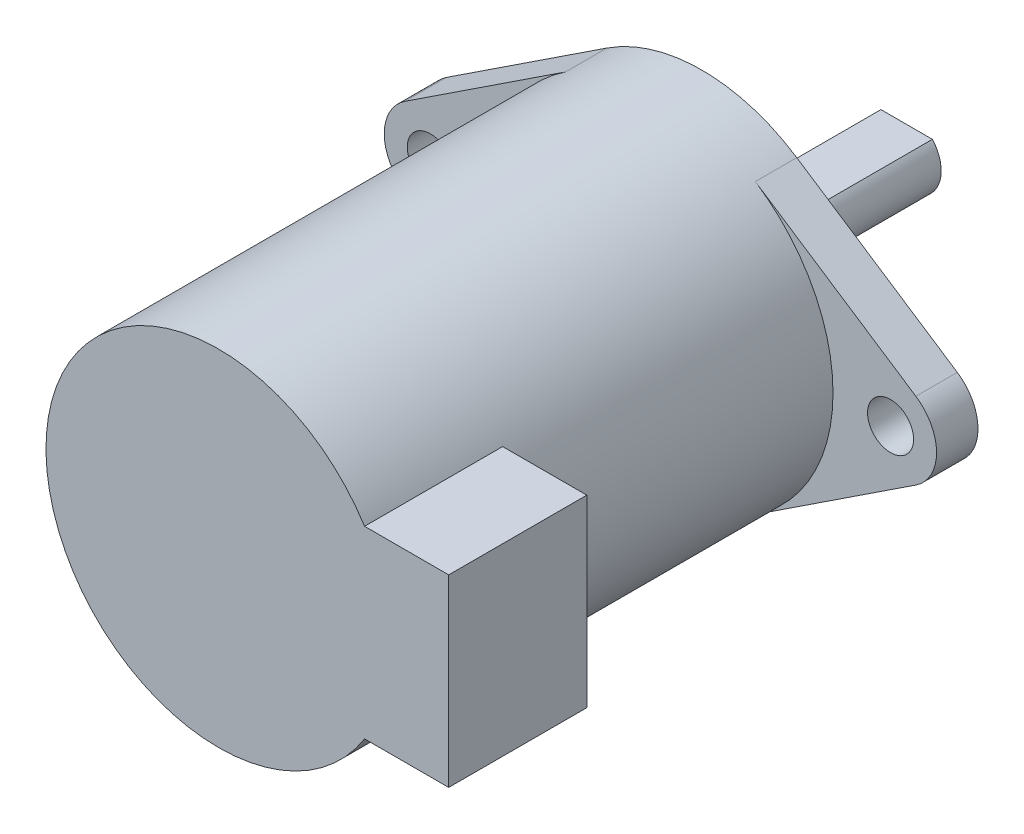
ISO-10303-21;
HEADER;
FILE_DESCRIPTION(('STEP AP214'),'2;1');
FILE_NAME('part.step','',(''),(''),'','','');
FILE_SCHEMA(('AUTOMOTIVE_DESIGN { 1 0 10303 214 1 1 1 1 }'));
ENDSEC;
DATA;
#1=APPLICATION_CONTEXT('core data for automotive mechanical design processes');
#2=APPLICATION_PROTOCOL_DEFINITION('international standard','automotive_design',2000,#1);
#3=PRODUCT_CONTEXT('',#1,'mechanical');
#4=PRODUCT('Part','Part','',(#3));
#5=PRODUCT_RELATED_PRODUCT_CATEGORY('part','',(#4));
#6=PRODUCT_DEFINITION_FORMATION('','',#4);
#7=PRODUCT_DEFINITION_CONTEXT('part definition',#1,'design');
#8=PRODUCT_DEFINITION('design','',#6,#7);
#9=PRODUCT_DEFINITION_SHAPE('','',#8);
#10=(LENGTH_UNIT() NAMED_UNIT(*) SI_UNIT(.MILLI.,.METRE.));
#11=(NAMED_UNIT(*) PLANE_ANGLE_UNIT() SI_UNIT($,.RADIAN.));
#12=(NAMED_UNIT(*) SI_UNIT($,.STERADIAN.) SOLID_ANGLE_UNIT());
#13=UNCERTAINTY_MEASURE_WITH_UNIT(LENGTH_MEASURE(1.E-05),#10,'distance_accuracy_value','');
#14=(GEOMETRIC_REPRESENTATION_CONTEXT(3) GLOBAL_UNCERTAINTY_ASSIGNED_CONTEXT((#13)) GLOBAL_UNIT_ASSIGNED_CONTEXT((#10,
#11,#12)) REPRESENTATION_CONTEXT('',''));
#15=CARTESIAN_POINT('',(0.,0.,0.));
#16=DIRECTION('',(0.,0.,1.));
#17=DIRECTION('',(1.,0.,0.));
#18=AXIS2_PLACEMENT_3D('',#15,#16,#17);
#19=CARTESIAN_POINT('',(0.,0.,21.));
#20=DIRECTION('',(0.,0.,-1.));
#21=DIRECTION('',(-1.,0.,0.));
#22=AXIS2_PLACEMENT_3D('',#19,#20,#21);
#23=CYLINDRICAL_SURFACE('',#22,7.5);
#24=DIRECTION('',(0.,0.,-1.));
#25=VECTOR('',#24,1.);
#26=CARTESIAN_POINT('',(-4.125,6.26373490818377,1.8));
#27=LINE('',#26,#25);
#28=CARTESIAN_POINT('',(-4.125,6.26373490818378,1.8));
#29=VERTEX_POINT('',#28);
#30=CARTESIAN_POINT('',(-4.125,6.26373490818377,0.));
#31=VERTEX_POINT('',#30);
#32=EDGE_CURVE('E259',#29,#31,#27,.T.);
#33=ORIENTED_EDGE('',*,*,#32,.F.);
#34=CARTESIAN_POINT('',(0.,0.,1.8));
#35=DIRECTION('',(0.,0.,-1.));
#36=DIRECTION('',(-1.,0.,0.));
#37=AXIS2_PLACEMENT_3D('',#34,#35,#36);
#38=CIRCLE('',#37,7.5);
#39=CARTESIAN_POINT('',(-4.125,-6.26373490818377,1.8));
#40=VERTEX_POINT('',#39);
#41=EDGE_CURVE('E290',#40,#29,#38,.T.);
#42=ORIENTED_EDGE('',*,*,#41,.F.);
#43=DIRECTION('',(0.,0.,-1.));
#44=VECTOR('',#43,1.);
#45=CARTESIAN_POINT('',(-4.125,-6.26373490818378,1.8));
#46=LINE('',#45,#44);
#47=CARTESIAN_POINT('',(-4.125,-6.26373490818378,0.));
#48=VERTEX_POINT('',#47);
#49=EDGE_CURVE('E241',#40,#48,#46,.T.);
#50=ORIENTED_EDGE('',*,*,#49,.T.);
#51=CARTESIAN_POINT('',(0.,0.,0.));
#52=DIRECTION('',(0.,0.,1.));
#53=DIRECTION('',(1.,0.,0.));
#54=AXIS2_PLACEMENT_3D('',#51,#52,#53);
#55=CIRCLE('',#54,7.5);
#56=CARTESIAN_POINT('',(4.125,-6.26373490818378,0.));
#57=VERTEX_POINT('',#56);
#58=EDGE_CURVE('E295',#48,#57,#55,.T.);
#59=ORIENTED_EDGE('',*,*,#58,.T.);
#60=DIRECTION('',(0.,0.,-1.));
#61=VECTOR('',#60,1.);
#62=CARTESIAN_POINT('',(4.125,-6.26373490818377,1.8));
#63=LINE('',#62,#61);
#64=CARTESIAN_POINT('',(4.125,-6.26373490818377,1.8));
#65=VERTEX_POINT('',#64);
#66=EDGE_CURVE('E245',#65,#57,#63,.T.);
#67=ORIENTED_EDGE('',*,*,#66,.F.);
#68=CARTESIAN_POINT('',(4.125,6.26373490818378,1.8));
#69=VERTEX_POINT('',#68);
#70=EDGE_CURVE('E47',#69,#65,#38,.T.);
#71=ORIENTED_EDGE('',*,*,#70,.F.);
#72=DIRECTION('',(0.,0.,-1.));
#73=VECTOR('',#72,1.);
#74=CARTESIAN_POINT('',(4.125,6.26373490818377,1.8));
#75=LINE('',#74,#73);
#76=CARTESIAN_POINT('',(4.125,6.26373490818377,0.));
#77=VERTEX_POINT('',#76);
#78=EDGE_CURVE('E255',#69,#77,#75,.T.);
#79=ORIENTED_EDGE('',*,*,#78,.T.);
#80=EDGE_CURVE('E302',#77,#31,#55,.T.);
#81=ORIENTED_EDGE('',*,*,#80,.T.);
#82=EDGE_LOOP('',(#33,#42,#50,#59,#67,#71,#79,#81));
#83=FACE_BOUND('',#82,.T.);
#84=DIRECTION('',(0.,0.,-1.));
#85=VECTOR('',#84,1.);
#86=CARTESIAN_POINT('',(6.34428877022476,4.,21.));
#87=LINE('',#86,#85);
#88=CARTESIAN_POINT('',(6.34428877022476,4.,15.));
#89=VERTEX_POINT('',#88);
#90=CARTESIAN_POINT('',(6.34428877022476,4.,21.));
#91=VERTEX_POINT('',#90);
#92=EDGE_CURVE('E54',#89,#91,#87,.F.);
#93=ORIENTED_EDGE('',*,*,#92,.F.);
#94=CARTESIAN_POINT('',(0.,0.,15.));
#95=DIRECTION('',(0.,0.,1.));
#96=DIRECTION('',(0.,-1.,0.));
#97=AXIS2_PLACEMENT_3D('',#94,#95,#96);
#98=CIRCLE('',#97,7.5);
#99=CARTESIAN_POINT('',(6.34428877022476,-4.,15.));
#100=VERTEX_POINT('',#99);
#101=EDGE_CURVE('E11',#100,#89,#98,.T.);
#102=ORIENTED_EDGE('',*,*,#101,.F.);
#103=DIRECTION('',(0.,0.,-1.));
#104=VECTOR('',#103,1.);
#105=CARTESIAN_POINT('',(6.34428877022476,-4.,21.));
#106=LINE('',#105,#104);
#107=CARTESIAN_POINT('',(6.34428877022476,-4.,21.));
#108=VERTEX_POINT('',#107);
#109=EDGE_CURVE('E58',#108,#100,#106,.T.);
#110=ORIENTED_EDGE('',*,*,#109,.F.);
#111=CARTESIAN_POINT('',(0.,0.,21.));
#112=DIRECTION('',(0.,0.,1.));
#113=DIRECTION('',(1.,0.,0.));
#114=AXIS2_PLACEMENT_3D('',#111,#112,#113);
#115=CIRCLE('',#114,7.5);
#116=EDGE_CURVE('E299',#91,#108,#115,.T.);
#117=ORIENTED_EDGE('',*,*,#116,.F.);
#118=EDGE_LOOP('',(#93,#102,#110,#117));
#119=FACE_BOUND('',#118,.T.);
#120=ADVANCED_FACE('F39',(#83,#119),#23,.T.);
#121=CARTESIAN_POINT('',(0.,0.,21.));
#122=DIRECTION('',(0.,0.,1.));
#123=DIRECTION('',(1.,0.,0.));
#124=AXIS2_PLACEMENT_3D('',#121,#122,#123);
#125=PLANE('',#124);
#126=ORIENTED_EDGE('',*,*,#116,.T.);
#127=DIRECTION('',(-1.,0.,0.));
#128=VECTOR('',#127,1.);
#129=CARTESIAN_POINT('',(10.,-4.,21.));
#130=LINE('',#129,#128);
#131=CARTESIAN_POINT('',(10.,-4.,21.));
#132=VERTEX_POINT('',#131);
#133=EDGE_CURVE('E166',#132,#108,#130,.T.);
#134=ORIENTED_EDGE('',*,*,#133,.F.);
#135=DIRECTION('',(0.,-1.,0.));
#136=VECTOR('',#135,1.);
#137=CARTESIAN_POINT('',(10.,4.,21.));
#138=LINE('',#137,#136);
#139=CARTESIAN_POINT('',(10.,4.,21.));
#140=VERTEX_POINT('',#139);
#141=EDGE_CURVE('E148',#140,#132,#138,.T.);
#142=ORIENTED_EDGE('',*,*,#141,.F.);
#143=DIRECTION('',(-1.,0.,0.));
#144=VECTOR('',#143,1.);
#145=CARTESIAN_POINT('',(10.,4.,21.));
#146=LINE('',#145,#144);
#147=EDGE_CURVE('E144',#140,#91,#146,.T.);
#148=ORIENTED_EDGE('',*,*,#147,.T.);
#149=EDGE_LOOP('',(#126,#134,#142,#148));
#150=FACE_BOUND('',#149,.T.);
#151=ADVANCED_FACE('F354',(#150),#125,.T.);
#152=CARTESIAN_POINT('',(0.,0.,0.));
#153=DIRECTION('',(0.,0.,1.));
#154=DIRECTION('',(1.,0.,0.));
#155=AXIS2_PLACEMENT_3D('',#152,#153,#154);
#156=PLANE('',#155);
#157=CARTESIAN_POINT('',(0.,0.,0.));
#158=DIRECTION('',(0.,0.,-1.));
#159=DIRECTION('',(-1.,0.,0.));
#160=AXIS2_PLACEMENT_3D('',#157,#158,#159);
#161=CIRCLE('',#160,3.);
#162=CARTESIAN_POINT('',(-3.,0.,0.));
#163=VERTEX_POINT('',#162);
#164=EDGE_CURVE('E291',#163,#163,#161,.T.);
#165=ORIENTED_EDGE('',*,*,#164,.F.);
#166=EDGE_LOOP('',(#165));
#167=FACE_BOUND('',#166,.T.);
#168=ORIENTED_EDGE('',*,*,#80,.F.);
#169=DIRECTION('',(0.835164654424503,-0.55,0.));
#170=VECTOR('',#169,1.);
#171=CARTESIAN_POINT('',(11.1,1.67032930884901,0.));
#172=LINE('',#171,#170);
#173=CARTESIAN_POINT('',(11.1,1.67032930884901,0.));
#174=VERTEX_POINT('',#173);
#175=EDGE_CURVE('E222',#77,#174,#172,.T.);
#176=ORIENTED_EDGE('',*,*,#175,.T.);
#177=CARTESIAN_POINT('',(10.,0.,0.));
#178=DIRECTION('',(0.,0.,-1.));
#179=DIRECTION('',(1.,0.,0.));
#180=AXIS2_PLACEMENT_3D('',#177,#178,#179);
#181=CIRCLE('',#180,2.);
#182=CARTESIAN_POINT('',(11.1,-1.67032930884901,0.));
#183=VERTEX_POINT('',#182);
#184=EDGE_CURVE('E226',#174,#183,#181,.T.);
#185=ORIENTED_EDGE('',*,*,#184,.T.);
#186=DIRECTION('',(-0.835164654424503,-0.55,0.));
#187=VECTOR('',#186,1.);
#188=CARTESIAN_POINT('',(11.1,-1.67032930884901,0.));
#189=LINE('',#188,#187);
#190=EDGE_CURVE('E230',#183,#57,#189,.T.);
#191=ORIENTED_EDGE('',*,*,#190,.T.);
#192=ORIENTED_EDGE('',*,*,#58,.F.);
#193=DIRECTION('',(-0.835164654424503,0.55,0.));
#194=VECTOR('',#193,1.);
#195=CARTESIAN_POINT('',(-11.1,-1.67032930884901,0.));
#196=LINE('',#195,#194);
#197=CARTESIAN_POINT('',(-11.1,-1.67032930884901,0.));
#198=VERTEX_POINT('',#197);
#199=EDGE_CURVE('E194',#48,#198,#196,.T.);
#200=ORIENTED_EDGE('',*,*,#199,.T.);
#201=CARTESIAN_POINT('',(-10.,0.,0.));
#202=DIRECTION('',(0.,0.,-1.));
#203=DIRECTION('',(-1.,0.,0.));
#204=AXIS2_PLACEMENT_3D('',#201,#202,#203);
#205=CIRCLE('',#204,2.);
#206=CARTESIAN_POINT('',(-11.1,1.67032930884901,0.));
#207=VERTEX_POINT('',#206);
#208=EDGE_CURVE('E185',#198,#207,#205,.T.);
#209=ORIENTED_EDGE('',*,*,#208,.T.);
#210=DIRECTION('',(0.835164654424503,0.55,0.));
#211=VECTOR('',#210,1.);
#212=CARTESIAN_POINT('',(-11.1,1.67032930884901,0.));
#213=LINE('',#212,#211);
#214=EDGE_CURVE('E218',#207,#31,#213,.T.);
#215=ORIENTED_EDGE('',*,*,#214,.T.);
#216=EDGE_LOOP('',(#168,#176,#185,#191,#192,#200,#209,#215));
#217=FACE_BOUND('',#216,.T.);
#218=CARTESIAN_POINT('',(-10.,0.,0.));
#219=DIRECTION('',(0.,0.,-1.));
#220=DIRECTION('',(-1.,0.,0.));
#221=AXIS2_PLACEMENT_3D('',#218,#219,#220);
#222=CIRCLE('',#221,1.);
#223=CARTESIAN_POINT('',(-11.,0.,0.));
#224=VERTEX_POINT('',#223);
#225=EDGE_CURVE('E177',#224,#224,#222,.T.);
#226=ORIENTED_EDGE('',*,*,#225,.F.);
#227=EDGE_LOOP('',(#226));
#228=FACE_BOUND('',#227,.T.);
#229=CARTESIAN_POINT('',(10.,0.,0.));
#230=DIRECTION('',(0.,0.,-1.));
#231=DIRECTION('',(1.,0.,0.));
#232=AXIS2_PLACEMENT_3D('',#229,#230,#231);
#233=CIRCLE('',#232,1.);
#234=CARTESIAN_POINT('',(11.,0.,0.));
#235=VERTEX_POINT('',#234);
#236=EDGE_CURVE('E172',#235,#235,#233,.T.);
#237=ORIENTED_EDGE('',*,*,#236,.F.);
#238=EDGE_LOOP('',(#237));
#239=FACE_BOUND('',#238,.T.);
#240=ADVANCED_FACE('F331',(#167,#217,#228,#239),#156,.F.);
#241=CARTESIAN_POINT('',(0.,0.,-2.));
#242=DIRECTION('',(0.,0.,1.));
#243=DIRECTION('',(1.,0.,0.));
#244=AXIS2_PLACEMENT_3D('',#241,#242,#243);
#245=CYLINDRICAL_SURFACE('',#244,3.);
#246=CARTESIAN_POINT('',(0.,0.,-2.));
#247=DIRECTION('',(0.,0.,-1.));
#248=DIRECTION('',(-1.,0.,0.));
#249=AXIS2_PLACEMENT_3D('',#246,#247,#248);
#250=CIRCLE('',#249,3.);
#251=CARTESIAN_POINT('',(-3.,0.,-2.));
#252=VERTEX_POINT('',#251);
#253=EDGE_CURVE('E285',#252,#252,#250,.T.);
#254=ORIENTED_EDGE('',*,*,#253,.F.);
#255=EDGE_LOOP('',(#254));
#256=FACE_BOUND('',#255,.T.);
#257=ORIENTED_EDGE('',*,*,#164,.T.);
#258=EDGE_LOOP('',(#257));
#259=FACE_BOUND('',#258,.T.);
#260=ADVANCED_FACE('F363',(#256,#259),#245,.T.);
#261=CARTESIAN_POINT('',(0.,0.,-2.));
#262=DIRECTION('',(0.,0.,-1.));
#263=DIRECTION('',(-1.,0.,0.));
#264=AXIS2_PLACEMENT_3D('',#261,#262,#263);
#265=PLANE('',#264);
#266=CARTESIAN_POINT('',(0.,0.,-2.));
#267=DIRECTION('',(0.,0.,-1.));
#268=DIRECTION('',(-1.,0.,0.));
#269=AXIS2_PLACEMENT_3D('',#266,#267,#268);
#270=CIRCLE('',#269,1.5);
#271=CARTESIAN_POINT('',(-1.5,0.,-2.));
#272=VERTEX_POINT('',#271);
#273=EDGE_CURVE('E286',#272,#272,#270,.T.);
#274=ORIENTED_EDGE('',*,*,#273,.F.);
#275=EDGE_LOOP('',(#274));
#276=FACE_BOUND('',#275,.T.);
#277=ORIENTED_EDGE('',*,*,#253,.T.);
#278=EDGE_LOOP('',(#277));
#279=FACE_BOUND('',#278,.T.);
#280=ADVANCED_FACE('F368',(#276,#279),#265,.T.);
#281=CARTESIAN_POINT('',(0.,0.,-8.9));
#282=DIRECTION('',(0.,0.,1.));
#283=DIRECTION('',(1.,0.,0.));
#284=AXIS2_PLACEMENT_3D('',#281,#282,#283);
#285=CYLINDRICAL_SURFACE('',#284,1.5);
#286=CARTESIAN_POINT('',(0.,0.,-8.9));
#287=DIRECTION('',(0.,0.,-1.));
#288=DIRECTION('',(-1.,0.,0.));
#289=AXIS2_PLACEMENT_3D('',#286,#287,#288);
#290=CIRCLE('',#289,1.5);
#291=CARTESIAN_POINT('',(1.1180339887499,1.,-8.9));
#292=VERTEX_POINT('',#291);
#293=CARTESIAN_POINT('',(-1.1180339887499,1.,-8.9));
#294=VERTEX_POINT('',#293);
#295=EDGE_CURVE('E279',#292,#294,#290,.T.);
#296=ORIENTED_EDGE('',*,*,#295,.F.);
#297=DIRECTION('',(0.,0.,-1.));
#298=VECTOR('',#297,1.);
#299=CARTESIAN_POINT('',(1.1180339887499,1.,-2.4));
#300=LINE('',#299,#298);
#301=CARTESIAN_POINT('',(1.1180339887499,1.,-2.4));
#302=VERTEX_POINT('',#301);
#303=EDGE_CURVE('E272',#302,#292,#300,.T.);
#304=ORIENTED_EDGE('',*,*,#303,.F.);
#305=CARTESIAN_POINT('',(0.,0.,-2.4));
#306=DIRECTION('',(0.,0.,-1.));
#307=DIRECTION('',(-1.,0.,0.));
#308=AXIS2_PLACEMENT_3D('',#305,#306,#307);
#309=CIRCLE('',#308,1.5);
#310=CARTESIAN_POINT('',(-1.1180339887499,1.,-2.4));
#311=VERTEX_POINT('',#310);
#312=EDGE_CURVE('E265',#311,#302,#309,.T.);
#313=ORIENTED_EDGE('',*,*,#312,.F.);
#314=DIRECTION('',(0.,0.,-1.));
#315=VECTOR('',#314,1.);
#316=CARTESIAN_POINT('',(-1.1180339887499,1.,-2.4));
#317=LINE('',#316,#315);
#318=EDGE_CURVE('E275',#311,#294,#317,.T.);
#319=ORIENTED_EDGE('',*,*,#318,.T.);
#320=EDGE_LOOP('',(#296,#304,#313,#319));
#321=FACE_BOUND('',#320,.T.);
#322=ORIENTED_EDGE('',*,*,#273,.T.);
#323=EDGE_LOOP('',(#322));
#324=FACE_BOUND('',#323,.T.);
#325=ADVANCED_FACE('F372',(#321,#324),#285,.T.);
#326=CARTESIAN_POINT('',(0.,0.,-8.9));
#327=DIRECTION('',(0.,0.,-1.));
#328=DIRECTION('',(-1.,0.,0.));
#329=AXIS2_PLACEMENT_3D('',#326,#327,#328);
#330=PLANE('',#329);
#331=DIRECTION('',(-1.,0.,0.));
#332=VECTOR('',#331,1.);
#333=CARTESIAN_POINT('',(1.1180339887499,1.,-8.9));
#334=LINE('',#333,#332);
#335=EDGE_CURVE('E240',#292,#294,#334,.T.);
#336=ORIENTED_EDGE('',*,*,#335,.F.);
#337=ORIENTED_EDGE('',*,*,#295,.T.);
#338=EDGE_LOOP('',(#336,#337));
#339=FACE_BOUND('',#338,.T.);
#340=ADVANCED_FACE('F376',(#339),#330,.T.);
#341=CARTESIAN_POINT('',(1.1180339887499,1.,-2.4));
#342=DIRECTION('',(0.,-1.,0.));
#343=DIRECTION('',(0.,0.,-1.));
#344=AXIS2_PLACEMENT_3D('',#341,#342,#343);
#345=PLANE('',#344);
#346=ORIENTED_EDGE('',*,*,#335,.T.);
#347=ORIENTED_EDGE('',*,*,#318,.F.);
#348=DIRECTION('',(-1.,0.,0.));
#349=VECTOR('',#348,1.);
#350=CARTESIAN_POINT('',(1.1180339887499,1.,-2.4));
#351=LINE('',#350,#349);
#352=EDGE_CURVE('E268',#302,#311,#351,.T.);
#353=ORIENTED_EDGE('',*,*,#352,.F.);
#354=ORIENTED_EDGE('',*,*,#303,.T.);
#355=EDGE_LOOP('',(#346,#347,#353,#354));
#356=FACE_BOUND('',#355,.T.);
#357=ADVANCED_FACE('F380',(#356),#345,.F.);
#358=CARTESIAN_POINT('',(0.,0.,-2.4));
#359=DIRECTION('',(0.,0.,-1.));
#360=DIRECTION('',(-1.,0.,0.));
#361=AXIS2_PLACEMENT_3D('',#358,#359,#360);
#362=PLANE('',#361);
#363=ORIENTED_EDGE('',*,*,#312,.T.);
#364=ORIENTED_EDGE('',*,*,#352,.T.);
#365=EDGE_LOOP('',(#363,#364));
#366=FACE_BOUND('',#365,.T.);
#367=ADVANCED_FACE('F384',(#366),#362,.T.);
#368=CARTESIAN_POINT('',(-10.,0.,1.8));
#369=DIRECTION('',(0.,0.,-1.));
#370=DIRECTION('',(-1.,0.,0.));
#371=AXIS2_PLACEMENT_3D('',#368,#369,#370);
#372=CYLINDRICAL_SURFACE('',#371,1.);
#373=CARTESIAN_POINT('',(-10.,0.,1.8));
#374=DIRECTION('',(0.,0.,-1.));
#375=DIRECTION('',(-1.,0.,0.));
#376=AXIS2_PLACEMENT_3D('',#373,#374,#375);
#377=CIRCLE('',#376,1.);
#378=CARTESIAN_POINT('',(-11.,0.,1.8));
#379=VERTEX_POINT('',#378);
#380=EDGE_CURVE('E181',#379,#379,#377,.T.);
#381=ORIENTED_EDGE('',*,*,#380,.F.);
#382=EDGE_LOOP('',(#381));
#383=FACE_BOUND('',#382,.T.);
#384=ORIENTED_EDGE('',*,*,#225,.T.);
#385=EDGE_LOOP('',(#384));
#386=FACE_BOUND('',#385,.T.);
#387=ADVANCED_FACE('F388',(#383,#386),#372,.F.);
#388=CARTESIAN_POINT('',(-10.,0.,1.8));
#389=DIRECTION('',(0.,0.,-1.));
#390=DIRECTION('',(-1.,0.,0.));
#391=AXIS2_PLACEMENT_3D('',#388,#389,#390);
#392=CYLINDRICAL_SURFACE('',#391,2.);
#393=ORIENTED_EDGE('',*,*,#208,.F.);
#394=DIRECTION('',(0.,0.,-1.));
#395=VECTOR('',#394,1.);
#396=CARTESIAN_POINT('',(-11.1,-1.67032930884901,1.8));
#397=LINE('',#396,#395);
#398=CARTESIAN_POINT('',(-11.1,-1.67032930884901,1.8));
#399=VERTEX_POINT('',#398);
#400=EDGE_CURVE('E237',#399,#198,#397,.T.);
#401=ORIENTED_EDGE('',*,*,#400,.F.);
#402=CARTESIAN_POINT('',(-10.,0.,1.8));
#403=DIRECTION('',(0.,0.,-1.));
#404=DIRECTION('',(-1.,0.,0.));
#405=AXIS2_PLACEMENT_3D('',#402,#403,#404);
#406=CIRCLE('',#405,2.);
#407=CARTESIAN_POINT('',(-11.1,1.67032930884901,1.8));
#408=VERTEX_POINT('',#407);
#409=EDGE_CURVE('E189',#399,#408,#406,.T.);
#410=ORIENTED_EDGE('',*,*,#409,.T.);
#411=DIRECTION('',(0.,0.,-1.));
#412=VECTOR('',#411,1.);
#413=CARTESIAN_POINT('',(-11.1,1.67032930884901,1.8));
#414=LINE('',#413,#412);
#415=EDGE_CURVE('E214',#408,#207,#414,.T.);
#416=ORIENTED_EDGE('',*,*,#415,.T.);
#417=EDGE_LOOP('',(#393,#401,#410,#416));
#418=FACE_BOUND('',#417,.T.);
#419=ADVANCED_FACE('F336',(#418),#392,.T.);
#420=CARTESIAN_POINT('',(-10.,0.,1.8));
#421=DIRECTION('',(0.,0.,-1.));
#422=DIRECTION('',(-1.,0.,0.));
#423=AXIS2_PLACEMENT_3D('',#420,#421,#422);
#424=PLANE('',#423);
#425=ORIENTED_EDGE('',*,*,#380,.T.);
#426=EDGE_LOOP('',(#425));
#427=FACE_BOUND('',#426,.T.);
#428=DIRECTION('',(-0.835164654424503,0.55,0.));
#429=VECTOR('',#428,1.);
#430=CARTESIAN_POINT('',(-11.1,-1.67032930884901,1.8));
#431=LINE('',#430,#429);
#432=EDGE_CURVE('E210',#40,#399,#431,.T.);
#433=ORIENTED_EDGE('',*,*,#432,.F.);
#434=ORIENTED_EDGE('',*,*,#41,.T.);
#435=DIRECTION('',(0.835164654424503,0.55,0.));
#436=VECTOR('',#435,1.);
#437=CARTESIAN_POINT('',(-11.1,1.67032930884901,1.8));
#438=LINE('',#437,#436);
#439=EDGE_CURVE('E193',#408,#29,#438,.T.);
#440=ORIENTED_EDGE('',*,*,#439,.F.);
#441=ORIENTED_EDGE('',*,*,#409,.F.);
#442=EDGE_LOOP('',(#433,#434,#440,#441));
#443=FACE_BOUND('',#442,.T.);
#444=ADVANCED_FACE('F338',(#427,#443),#424,.F.);
#445=CARTESIAN_POINT('',(-11.1,1.67032930884901,1.8));
#446=DIRECTION('',(-0.55,0.835164654424503,0.));
#447=DIRECTION('',(-0.835164654424503,-0.55,0.));
#448=AXIS2_PLACEMENT_3D('',#445,#446,#447);
#449=PLANE('',#448);
#450=ORIENTED_EDGE('',*,*,#214,.F.);
#451=ORIENTED_EDGE('',*,*,#415,.F.);
#452=ORIENTED_EDGE('',*,*,#439,.T.);
#453=ORIENTED_EDGE('',*,*,#32,.T.);
#454=EDGE_LOOP('',(#450,#451,#452,#453));
#455=FACE_BOUND('',#454,.T.);
#456=ADVANCED_FACE('F330',(#455),#449,.T.);
#457=CARTESIAN_POINT('',(-11.1,-1.67032930884901,1.8));
#458=DIRECTION('',(-0.55,-0.835164654424503,0.));
#459=DIRECTION('',(0.835164654424503,-0.55,0.));
#460=AXIS2_PLACEMENT_3D('',#457,#458,#459);
#461=PLANE('',#460);
#462=ORIENTED_EDGE('',*,*,#199,.F.);
#463=ORIENTED_EDGE('',*,*,#49,.F.);
#464=ORIENTED_EDGE('',*,*,#432,.T.);
#465=ORIENTED_EDGE('',*,*,#400,.T.);
#466=EDGE_LOOP('',(#462,#463,#464,#465));
#467=FACE_BOUND('',#466,.T.);
#468=ADVANCED_FACE('F341',(#467),#461,.T.);
#469=CARTESIAN_POINT('',(10.,0.,1.8));
#470=DIRECTION('',(0.,0.,-1.));
#471=DIRECTION('',(1.,0.,0.));
#472=AXIS2_PLACEMENT_3D('',#469,#470,#471);
#473=CIRCLE('',#472,1.);
#474=CARTESIAN_POINT('',(11.,0.,1.8));
#475=VERTEX_POINT('',#474);
#476=EDGE_CURVE('E173',#475,#475,#473,.T.);
#477=ORIENTED_EDGE('',*,*,#476,.T.);
#478=EDGE_LOOP('',(#477));
#479=FACE_BOUND('',#478,.T.);
#480=DIRECTION('',(0.835164654424503,-0.55,0.));
#481=VECTOR('',#480,1.);
#482=CARTESIAN_POINT('',(11.1,1.67032930884901,1.8));
#483=LINE('',#482,#481);
#484=CARTESIAN_POINT('',(11.1,1.67032930884901,1.8));
#485=VERTEX_POINT('',#484);
#486=EDGE_CURVE('E198',#69,#485,#483,.T.);
#487=ORIENTED_EDGE('',*,*,#486,.F.);
#488=ORIENTED_EDGE('',*,*,#70,.T.);
#489=DIRECTION('',(-0.835164654424503,-0.55,0.));
#490=VECTOR('',#489,1.);
#491=CARTESIAN_POINT('',(11.1,-1.67032930884901,1.8));
#492=LINE('',#491,#490);
#493=CARTESIAN_POINT('',(11.1,-1.67032930884901,1.8));
#494=VERTEX_POINT('',#493);
#495=EDGE_CURVE('E206',#494,#65,#492,.T.);
#496=ORIENTED_EDGE('',*,*,#495,.F.);
#497=CARTESIAN_POINT('',(10.,0.,1.8));
#498=DIRECTION('',(0.,0.,-1.));
#499=DIRECTION('',(1.,0.,0.));
#500=AXIS2_PLACEMENT_3D('',#497,#498,#499);
#501=CIRCLE('',#500,2.);
#502=EDGE_CURVE('E202',#485,#494,#501,.T.);
#503=ORIENTED_EDGE('',*,*,#502,.F.);
#504=EDGE_LOOP('',(#487,#488,#496,#503));
#505=FACE_BOUND('',#504,.T.);
#506=ADVANCED_FACE('F314',(#479,#505),#424,.F.);
#507=CARTESIAN_POINT('',(11.1,-1.67032930884901,1.8));
#508=DIRECTION('',(0.55,-0.835164654424503,0.));
#509=DIRECTION('',(0.835164654424503,0.55,0.));
#510=AXIS2_PLACEMENT_3D('',#507,#508,#509);
#511=PLANE('',#510);
#512=ORIENTED_EDGE('',*,*,#190,.F.);
#513=DIRECTION('',(0.,0.,-1.));
#514=VECTOR('',#513,1.);
#515=CARTESIAN_POINT('',(11.1,-1.67032930884901,1.8));
#516=LINE('',#515,#514);
#517=EDGE_CURVE('E249',#494,#183,#516,.T.);
#518=ORIENTED_EDGE('',*,*,#517,.F.);
#519=ORIENTED_EDGE('',*,*,#495,.T.);
#520=ORIENTED_EDGE('',*,*,#66,.T.);
#521=EDGE_LOOP('',(#512,#518,#519,#520));
#522=FACE_BOUND('',#521,.T.);
#523=ADVANCED_FACE('F320',(#522),#511,.T.);
#524=CARTESIAN_POINT('',(10.,0.,1.8));
#525=DIRECTION('',(0.,0.,-1.));
#526=DIRECTION('',(-1.,0.,0.));
#527=AXIS2_PLACEMENT_3D('',#524,#525,#526);
#528=CYLINDRICAL_SURFACE('',#527,2.);
#529=ORIENTED_EDGE('',*,*,#184,.F.);
#530=DIRECTION('',(0.,0.,-1.));
#531=VECTOR('',#530,1.);
#532=CARTESIAN_POINT('',(11.1,1.67032930884901,1.8));
#533=LINE('',#532,#531);
#534=EDGE_CURVE('E252',#485,#174,#533,.T.);
#535=ORIENTED_EDGE('',*,*,#534,.F.);
#536=ORIENTED_EDGE('',*,*,#502,.T.);
#537=ORIENTED_EDGE('',*,*,#517,.T.);
#538=EDGE_LOOP('',(#529,#535,#536,#537));
#539=FACE_BOUND('',#538,.T.);
#540=ADVANCED_FACE('F323',(#539),#528,.T.);
#541=CARTESIAN_POINT('',(11.1,1.67032930884901,1.8));
#542=DIRECTION('',(0.55,0.835164654424503,0.));
#543=DIRECTION('',(-0.835164654424503,0.55,0.));
#544=AXIS2_PLACEMENT_3D('',#541,#542,#543);
#545=PLANE('',#544);
#546=ORIENTED_EDGE('',*,*,#175,.F.);
#547=ORIENTED_EDGE('',*,*,#78,.F.);
#548=ORIENTED_EDGE('',*,*,#486,.T.);
#549=ORIENTED_EDGE('',*,*,#534,.T.);
#550=EDGE_LOOP('',(#546,#547,#548,#549));
#551=FACE_BOUND('',#550,.T.);
#552=ADVANCED_FACE('F326',(#551),#545,.T.);
#553=CARTESIAN_POINT('',(10.,0.,1.8));
#554=DIRECTION('',(0.,0.,-1.));
#555=DIRECTION('',(-1.,0.,0.));
#556=AXIS2_PLACEMENT_3D('',#553,#554,#555);
#557=CYLINDRICAL_SURFACE('',#556,1.);
#558=ORIENTED_EDGE('',*,*,#476,.F.);
#559=EDGE_LOOP('',(#558));
#560=FACE_BOUND('',#559,.T.);
#561=ORIENTED_EDGE('',*,*,#236,.T.);
#562=EDGE_LOOP('',(#561));
#563=FACE_BOUND('',#562,.T.);
#564=ADVANCED_FACE('F394',(#560,#563),#557,.F.);
#565=CARTESIAN_POINT('',(10.,4.,21.));
#566=DIRECTION('',(0.,-1.,0.));
#567=DIRECTION('',(0.,0.,-1.));
#568=AXIS2_PLACEMENT_3D('',#565,#566,#567);
#569=PLANE('',#568);
#570=DIRECTION('',(-1.,0.,0.));
#571=VECTOR('',#570,1.);
#572=CARTESIAN_POINT('',(10.,4.,15.));
#573=LINE('',#572,#571);
#574=CARTESIAN_POINT('',(10.,4.,15.));
#575=VERTEX_POINT('',#574);
#576=EDGE_CURVE('E142',#575,#89,#573,.T.);
#577=ORIENTED_EDGE('',*,*,#576,.T.);
#578=ORIENTED_EDGE('',*,*,#92,.T.);
#579=ORIENTED_EDGE('',*,*,#147,.F.);
#580=DIRECTION('',(0.,0.,1.));
#581=VECTOR('',#580,1.);
#582=CARTESIAN_POINT('',(10.,4.,21.));
#583=LINE('',#582,#581);
#584=EDGE_CURVE('E138',#575,#140,#583,.T.);
#585=ORIENTED_EDGE('',*,*,#584,.F.);
#586=EDGE_LOOP('',(#577,#578,#579,#585));
#587=FACE_BOUND('',#586,.T.);
#588=ADVANCED_FACE('F140',(#587),#569,.F.);
#589=CARTESIAN_POINT('',(10.,-4.,21.));
#590=DIRECTION('',(0.,1.,0.));
#591=DIRECTION('',(0.,0.,1.));
#592=AXIS2_PLACEMENT_3D('',#589,#590,#591);
#593=PLANE('',#592);
#594=ORIENTED_EDGE('',*,*,#133,.T.);
#595=ORIENTED_EDGE('',*,*,#109,.T.);
#596=DIRECTION('',(-1.,0.,0.));
#597=VECTOR('',#596,1.);
#598=CARTESIAN_POINT('',(10.,-4.,15.));
#599=LINE('',#598,#597);
#600=CARTESIAN_POINT('',(10.,-4.,15.));
#601=VERTEX_POINT('',#600);
#602=EDGE_CURVE('E562',#601,#100,#599,.T.);
#603=ORIENTED_EDGE('',*,*,#602,.F.);
#604=DIRECTION('',(0.,0.,-1.));
#605=VECTOR('',#604,1.);
#606=CARTESIAN_POINT('',(10.,-4.,21.));
#607=LINE('',#606,#605);
#608=EDGE_CURVE('E154',#132,#601,#607,.T.);
#609=ORIENTED_EDGE('',*,*,#608,.F.);
#610=EDGE_LOOP('',(#594,#595,#603,#609));
#611=FACE_BOUND('',#610,.T.);
#612=ADVANCED_FACE('F422',(#611),#593,.F.);
#613=CARTESIAN_POINT('',(10.,4.,15.));
#614=DIRECTION('',(0.,0.,1.));
#615=DIRECTION('',(0.,-1.,0.));
#616=AXIS2_PLACEMENT_3D('',#613,#614,#615);
#617=PLANE('',#616);
#618=ORIENTED_EDGE('',*,*,#602,.T.);
#619=ORIENTED_EDGE('',*,*,#101,.T.);
#620=ORIENTED_EDGE('',*,*,#576,.F.);
#621=DIRECTION('',(0.,1.,0.));
#622=VECTOR('',#621,1.);
#623=CARTESIAN_POINT('',(10.,4.,15.));
#624=LINE('',#623,#622);
#625=EDGE_CURVE('E149',#601,#575,#624,.T.);
#626=ORIENTED_EDGE('',*,*,#625,.F.);
#627=EDGE_LOOP('',(#618,#619,#620,#626));
#628=FACE_BOUND('',#627,.T.);
#629=ADVANCED_FACE('F160',(#628),#617,.F.);
#630=CARTESIAN_POINT('',(10.,0.,0.));
#631=DIRECTION('',(1.,0.,0.));
#632=DIRECTION('',(0.,0.,-1.));
#633=AXIS2_PLACEMENT_3D('',#630,#631,#632);
#634=PLANE('',#633);
#635=ORIENTED_EDGE('',*,*,#625,.T.);
#636=ORIENTED_EDGE('',*,*,#584,.T.);
#637=ORIENTED_EDGE('',*,*,#141,.T.);
#638=ORIENTED_EDGE('',*,*,#608,.T.);
#639=EDGE_LOOP('',(#635,#636,#637,#638));
#640=FACE_BOUND('',#639,.T.);
#641=ADVANCED_FACE('F152',(#640),#634,.T.);
#642=CLOSED_SHELL('',(#120,#151,#240,#260,#280,#325,#340,#357,#367,#387,#419,#444,#456,#468,
#506,#523,#540,#552,#564,#588,#612,#629,#641));
#643=MANIFOLD_SOLID_BREP('B2',#642);
#644=ADVANCED_BREP_SHAPE_REPRESENTATION('',(#18,#643),#14);
#645=SHAPE_DEFINITION_REPRESENTATION(#9,#644);
ENDSEC;
END-ISO-10303-21;
